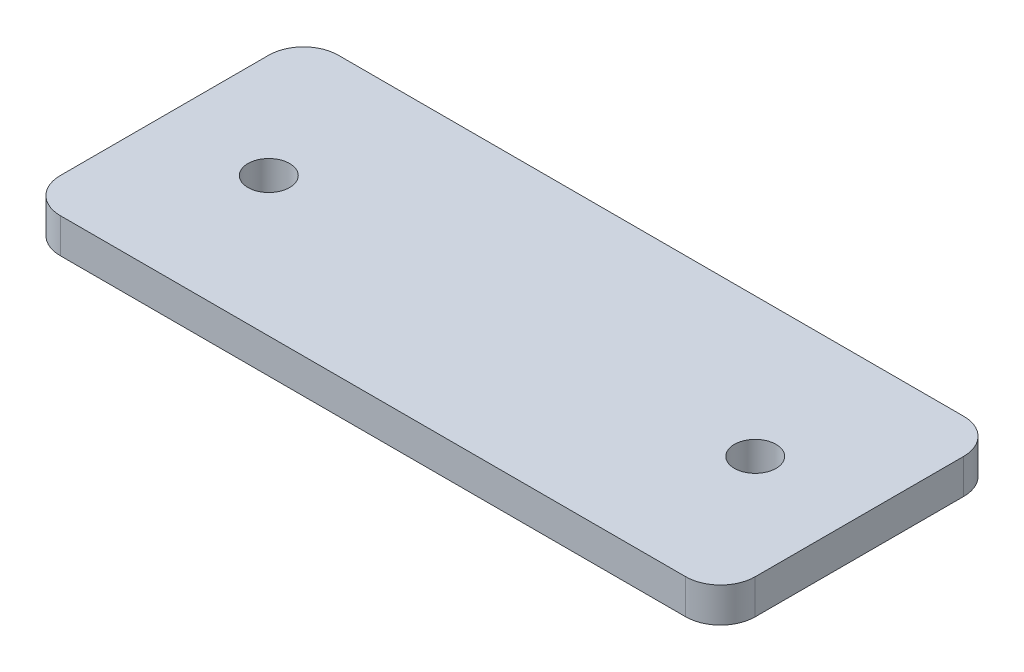
ISO-10303-21;
HEADER;
FILE_DESCRIPTION(('STEP AP214'),'2;1');
FILE_NAME('part.step','',(''),(''),'','','');
FILE_SCHEMA(('AUTOMOTIVE_DESIGN { 1 0 10303 214 1 1 1 1 }'));
ENDSEC;
DATA;
#1=APPLICATION_CONTEXT('core data for automotive mechanical design processes');
#2=APPLICATION_PROTOCOL_DEFINITION('international standard','automotive_design',2000,#1);
#3=PRODUCT_CONTEXT('',#1,'mechanical');
#4=PRODUCT('Part','Part','',(#3));
#5=PRODUCT_RELATED_PRODUCT_CATEGORY('part','',(#4));
#6=PRODUCT_DEFINITION_FORMATION('','',#4);
#7=PRODUCT_DEFINITION_CONTEXT('part definition',#1,'design');
#8=PRODUCT_DEFINITION('design','',#6,#7);
#9=PRODUCT_DEFINITION_SHAPE('','',#8);
#10=(LENGTH_UNIT() NAMED_UNIT(*) SI_UNIT(.MILLI.,.METRE.));
#11=(NAMED_UNIT(*) PLANE_ANGLE_UNIT() SI_UNIT($,.RADIAN.));
#12=(NAMED_UNIT(*) SI_UNIT($,.STERADIAN.) SOLID_ANGLE_UNIT());
#13=UNCERTAINTY_MEASURE_WITH_UNIT(LENGTH_MEASURE(1.E-05),#10,'distance_accuracy_value','');
#14=(GEOMETRIC_REPRESENTATION_CONTEXT(3) GLOBAL_UNCERTAINTY_ASSIGNED_CONTEXT((#13)) GLOBAL_UNIT_ASSIGNED_CONTEXT((#10,
#11,#12)) REPRESENTATION_CONTEXT('',''));
#15=CARTESIAN_POINT('',(0.,0.,0.));
#16=DIRECTION('',(0.,0.,1.));
#17=DIRECTION('',(1.,0.,0.));
#18=AXIS2_PLACEMENT_3D('',#15,#16,#17);
#19=CARTESIAN_POINT('',(-50.,5.,20.));
#20=DIRECTION('',(1.,0.,0.));
#21=DIRECTION('',(0.,0.,-1.));
#22=AXIS2_PLACEMENT_3D('',#19,#20,#21);
#23=PLANE('',#22);
#24=DIRECTION('',(0.,0.,1.));
#25=VECTOR('',#24,1.);
#26=CARTESIAN_POINT('',(-50.,5.,20.));
#27=LINE('',#26,#25);
#28=CARTESIAN_POINT('',(-50.,5.,-15.));
#29=VERTEX_POINT('',#28);
#30=CARTESIAN_POINT('',(-50.,5.,15.));
#31=VERTEX_POINT('',#30);
#32=EDGE_CURVE('E116',#29,#31,#27,.T.);
#33=ORIENTED_EDGE('',*,*,#32,.F.);
#34=DIRECTION('',(0.,-1.,0.));
#35=VECTOR('',#34,1.);
#36=CARTESIAN_POINT('',(-50.,5.,-15.));
#37=LINE('',#36,#35);
#38=CARTESIAN_POINT('',(-50.,0.,-15.));
#39=VERTEX_POINT('',#38);
#40=EDGE_CURVE('E101',#29,#39,#37,.T.);
#41=ORIENTED_EDGE('',*,*,#40,.T.);
#42=DIRECTION('',(0.,0.,1.));
#43=VECTOR('',#42,1.);
#44=CARTESIAN_POINT('',(-50.,0.,20.));
#45=LINE('',#44,#43);
#46=CARTESIAN_POINT('',(-50.,0.,15.));
#47=VERTEX_POINT('',#46);
#48=EDGE_CURVE('E113',#39,#47,#45,.T.);
#49=ORIENTED_EDGE('',*,*,#48,.T.);
#50=DIRECTION('',(0.,-1.,0.));
#51=VECTOR('',#50,1.);
#52=CARTESIAN_POINT('',(-50.,5.,15.));
#53=LINE('',#52,#51);
#54=EDGE_CURVE('E118',#47,#31,#53,.F.);
#55=ORIENTED_EDGE('',*,*,#54,.T.);
#56=EDGE_LOOP('',(#33,#41,#49,#55));
#57=FACE_BOUND('',#56,.T.);
#58=ADVANCED_FACE('F32',(#57),#23,.F.);
#59=CARTESIAN_POINT('',(50.,5.,20.));
#60=DIRECTION('',(0.,0.,-1.));
#61=DIRECTION('',(-1.,0.,0.));
#62=AXIS2_PLACEMENT_3D('',#59,#60,#61);
#63=PLANE('',#62);
#64=DIRECTION('',(1.,0.,0.));
#65=VECTOR('',#64,1.);
#66=CARTESIAN_POINT('',(50.,5.,20.));
#67=LINE('',#66,#65);
#68=CARTESIAN_POINT('',(-45.,5.,20.));
#69=VERTEX_POINT('',#68);
#70=CARTESIAN_POINT('',(45.,5.,20.));
#71=VERTEX_POINT('',#70);
#72=EDGE_CURVE('E171',#69,#71,#67,.T.);
#73=ORIENTED_EDGE('',*,*,#72,.F.);
#74=DIRECTION('',(0.,-1.,0.));
#75=VECTOR('',#74,1.);
#76=CARTESIAN_POINT('',(-45.,5.,20.));
#77=LINE('',#76,#75);
#78=CARTESIAN_POINT('',(-45.,0.,20.));
#79=VERTEX_POINT('',#78);
#80=EDGE_CURVE('E155',#69,#79,#77,.T.);
#81=ORIENTED_EDGE('',*,*,#80,.T.);
#82=DIRECTION('',(1.,0.,0.));
#83=VECTOR('',#82,1.);
#84=CARTESIAN_POINT('',(50.,0.,20.));
#85=LINE('',#84,#83);
#86=CARTESIAN_POINT('',(45.,0.,20.));
#87=VERTEX_POINT('',#86);
#88=EDGE_CURVE('E122',#79,#87,#85,.T.);
#89=ORIENTED_EDGE('',*,*,#88,.T.);
#90=DIRECTION('',(0.,-1.,0.));
#91=VECTOR('',#90,1.);
#92=CARTESIAN_POINT('',(45.,5.,20.));
#93=LINE('',#92,#91);
#94=EDGE_CURVE('E153',#87,#71,#93,.F.);
#95=ORIENTED_EDGE('',*,*,#94,.T.);
#96=EDGE_LOOP('',(#73,#81,#89,#95));
#97=FACE_BOUND('',#96,.T.);
#98=ADVANCED_FACE('F207',(#97),#63,.F.);
#99=CARTESIAN_POINT('',(50.,5.,20.));
#100=DIRECTION('',(-1.,0.,0.));
#101=DIRECTION('',(0.,0.,1.));
#102=AXIS2_PLACEMENT_3D('',#99,#100,#101);
#103=PLANE('',#102);
#104=DIRECTION('',(0.,0.,-1.));
#105=VECTOR('',#104,1.);
#106=CARTESIAN_POINT('',(50.,0.,20.));
#107=LINE('',#106,#105);
#108=CARTESIAN_POINT('',(50.,0.,15.));
#109=VERTEX_POINT('',#108);
#110=CARTESIAN_POINT('',(50.,0.,-15.));
#111=VERTEX_POINT('',#110);
#112=EDGE_CURVE('E126',#109,#111,#107,.T.);
#113=ORIENTED_EDGE('',*,*,#112,.T.);
#114=DIRECTION('',(0.,-1.,0.));
#115=VECTOR('',#114,1.);
#116=CARTESIAN_POINT('',(50.,5.,-15.));
#117=LINE('',#116,#115);
#118=CARTESIAN_POINT('',(50.,5.,-15.));
#119=VERTEX_POINT('',#118);
#120=EDGE_CURVE('E11',#111,#119,#117,.F.);
#121=ORIENTED_EDGE('',*,*,#120,.T.);
#122=DIRECTION('',(0.,0.,-1.));
#123=VECTOR('',#122,1.);
#124=CARTESIAN_POINT('',(50.,5.,20.));
#125=LINE('',#124,#123);
#126=CARTESIAN_POINT('',(50.,5.,15.));
#127=VERTEX_POINT('',#126);
#128=EDGE_CURVE('E161',#127,#119,#125,.T.);
#129=ORIENTED_EDGE('',*,*,#128,.F.);
#130=DIRECTION('',(0.,-1.,0.));
#131=VECTOR('',#130,1.);
#132=CARTESIAN_POINT('',(50.,5.,15.));
#133=LINE('',#132,#131);
#134=EDGE_CURVE('E40',#127,#109,#133,.T.);
#135=ORIENTED_EDGE('',*,*,#134,.T.);
#136=EDGE_LOOP('',(#113,#121,#129,#135));
#137=FACE_BOUND('',#136,.T.);
#138=ADVANCED_FACE('F160',(#137),#103,.F.);
#139=CARTESIAN_POINT('',(50.,5.,-20.));
#140=DIRECTION('',(0.,0.,1.));
#141=DIRECTION('',(1.,0.,0.));
#142=AXIS2_PLACEMENT_3D('',#139,#140,#141);
#143=PLANE('',#142);
#144=DIRECTION('',(-1.,0.,0.));
#145=VECTOR('',#144,1.);
#146=CARTESIAN_POINT('',(50.,0.,-20.));
#147=LINE('',#146,#145);
#148=CARTESIAN_POINT('',(45.,0.,-20.));
#149=VERTEX_POINT('',#148);
#150=CARTESIAN_POINT('',(-45.,0.,-20.));
#151=VERTEX_POINT('',#150);
#152=EDGE_CURVE('E136',#149,#151,#147,.T.);
#153=ORIENTED_EDGE('',*,*,#152,.T.);
#154=DIRECTION('',(0.,-1.,0.));
#155=VECTOR('',#154,1.);
#156=CARTESIAN_POINT('',(-45.,5.,-20.));
#157=LINE('',#156,#155);
#158=CARTESIAN_POINT('',(-45.,5.,-20.));
#159=VERTEX_POINT('',#158);
#160=EDGE_CURVE('E102',#151,#159,#157,.F.);
#161=ORIENTED_EDGE('',*,*,#160,.T.);
#162=DIRECTION('',(-1.,0.,0.));
#163=VECTOR('',#162,1.);
#164=CARTESIAN_POINT('',(50.,5.,-20.));
#165=LINE('',#164,#163);
#166=CARTESIAN_POINT('',(45.,5.,-20.));
#167=VERTEX_POINT('',#166);
#168=EDGE_CURVE('E132',#167,#159,#165,.T.);
#169=ORIENTED_EDGE('',*,*,#168,.F.);
#170=DIRECTION('',(0.,-1.,0.));
#171=VECTOR('',#170,1.);
#172=CARTESIAN_POINT('',(45.,5.,-20.));
#173=LINE('',#172,#171);
#174=EDGE_CURVE('E107',#167,#149,#173,.T.);
#175=ORIENTED_EDGE('',*,*,#174,.T.);
#176=EDGE_LOOP('',(#153,#161,#169,#175));
#177=FACE_BOUND('',#176,.T.);
#178=ADVANCED_FACE('F169',(#177),#143,.F.);
#179=CARTESIAN_POINT('',(0.,5.,0.));
#180=DIRECTION('',(0.,1.,0.));
#181=DIRECTION('',(0.,0.,1.));
#182=AXIS2_PLACEMENT_3D('',#179,#180,#181);
#183=PLANE('',#182);
#184=CARTESIAN_POINT('',(35.,5.,0.));
#185=DIRECTION('',(0.,1.,0.));
#186=DIRECTION('',(0.,0.,1.));
#187=AXIS2_PLACEMENT_3D('',#184,#185,#186);
#188=CIRCLE('',#187,3.);
#189=CARTESIAN_POINT('',(35.,5.,3.));
#190=VERTEX_POINT('',#189);
#191=EDGE_CURVE('E178',#190,#190,#188,.T.);
#192=ORIENTED_EDGE('',*,*,#191,.F.);
#193=EDGE_LOOP('',(#192));
#194=FACE_BOUND('',#193,.T.);
#195=CARTESIAN_POINT('',(-35.,5.,0.));
#196=DIRECTION('',(0.,1.,0.));
#197=DIRECTION('',(0.,0.,1.));
#198=AXIS2_PLACEMENT_3D('',#195,#196,#197);
#199=CIRCLE('',#198,3.);
#200=CARTESIAN_POINT('',(-35.,5.,3.));
#201=VERTEX_POINT('',#200);
#202=EDGE_CURVE('E129',#201,#201,#199,.T.);
#203=ORIENTED_EDGE('',*,*,#202,.F.);
#204=EDGE_LOOP('',(#203));
#205=FACE_BOUND('',#204,.T.);
#206=ORIENTED_EDGE('',*,*,#168,.T.);
#207=CARTESIAN_POINT('',(-45.,5.,-15.));
#208=DIRECTION('',(0.,1.,0.));
#209=DIRECTION('',(0.,0.,1.));
#210=AXIS2_PLACEMENT_3D('',#207,#208,#209);
#211=CIRCLE('',#210,5.);
#212=EDGE_CURVE('E151',#159,#29,#211,.T.);
#213=ORIENTED_EDGE('',*,*,#212,.T.);
#214=ORIENTED_EDGE('',*,*,#32,.T.);
#215=CARTESIAN_POINT('',(-45.,5.,15.));
#216=DIRECTION('',(0.,1.,0.));
#217=DIRECTION('',(0.,0.,1.));
#218=AXIS2_PLACEMENT_3D('',#215,#216,#217);
#219=CIRCLE('',#218,5.);
#220=EDGE_CURVE('E149',#31,#69,#219,.T.);
#221=ORIENTED_EDGE('',*,*,#220,.T.);
#222=ORIENTED_EDGE('',*,*,#72,.T.);
#223=CARTESIAN_POINT('',(45.,5.,15.));
#224=DIRECTION('',(0.,1.,0.));
#225=DIRECTION('',(0.,0.,1.));
#226=AXIS2_PLACEMENT_3D('',#223,#224,#225);
#227=CIRCLE('',#226,5.);
#228=EDGE_CURVE('E52',#71,#127,#227,.T.);
#229=ORIENTED_EDGE('',*,*,#228,.T.);
#230=ORIENTED_EDGE('',*,*,#128,.T.);
#231=CARTESIAN_POINT('',(45.,5.,-15.));
#232=DIRECTION('',(0.,1.,0.));
#233=DIRECTION('',(0.,0.,1.));
#234=AXIS2_PLACEMENT_3D('',#231,#232,#233);
#235=CIRCLE('',#234,5.);
#236=EDGE_CURVE('E147',#119,#167,#235,.T.);
#237=ORIENTED_EDGE('',*,*,#236,.T.);
#238=EDGE_LOOP('',(#206,#213,#214,#221,#222,#229,#230,#237));
#239=FACE_BOUND('',#238,.T.);
#240=ADVANCED_FACE('F193',(#194,#205,#239),#183,.T.);
#241=CARTESIAN_POINT('',(0.,0.,0.));
#242=DIRECTION('',(0.,1.,0.));
#243=DIRECTION('',(0.,0.,1.));
#244=AXIS2_PLACEMENT_3D('',#241,#242,#243);
#245=PLANE('',#244);
#246=CARTESIAN_POINT('',(35.,0.,0.));
#247=DIRECTION('',(0.,1.,0.));
#248=DIRECTION('',(0.,0.,1.));
#249=AXIS2_PLACEMENT_3D('',#246,#247,#248);
#250=CIRCLE('',#249,3.);
#251=CARTESIAN_POINT('',(35.,0.,3.));
#252=VERTEX_POINT('',#251);
#253=EDGE_CURVE('E176',#252,#252,#250,.T.);
#254=ORIENTED_EDGE('',*,*,#253,.T.);
#255=EDGE_LOOP('',(#254));
#256=FACE_BOUND('',#255,.T.);
#257=CARTESIAN_POINT('',(-35.,0.,0.));
#258=DIRECTION('',(0.,1.,0.));
#259=DIRECTION('',(0.,0.,1.));
#260=AXIS2_PLACEMENT_3D('',#257,#258,#259);
#261=CIRCLE('',#260,3.);
#262=CARTESIAN_POINT('',(-35.,0.,3.));
#263=VERTEX_POINT('',#262);
#264=EDGE_CURVE('E123',#263,#263,#261,.T.);
#265=ORIENTED_EDGE('',*,*,#264,.T.);
#266=EDGE_LOOP('',(#265));
#267=FACE_BOUND('',#266,.T.);
#268=ORIENTED_EDGE('',*,*,#48,.F.);
#269=CARTESIAN_POINT('',(-45.,0.,-15.));
#270=DIRECTION('',(0.,1.,0.));
#271=DIRECTION('',(0.,0.,1.));
#272=AXIS2_PLACEMENT_3D('',#269,#270,#271);
#273=CIRCLE('',#272,5.);
#274=EDGE_CURVE('E97',#39,#151,#273,.F.);
#275=ORIENTED_EDGE('',*,*,#274,.T.);
#276=ORIENTED_EDGE('',*,*,#152,.F.);
#277=CARTESIAN_POINT('',(45.,0.,-15.));
#278=DIRECTION('',(0.,1.,0.));
#279=DIRECTION('',(0.,0.,1.));
#280=AXIS2_PLACEMENT_3D('',#277,#278,#279);
#281=CIRCLE('',#280,5.);
#282=EDGE_CURVE('E140',#149,#111,#281,.F.);
#283=ORIENTED_EDGE('',*,*,#282,.T.);
#284=ORIENTED_EDGE('',*,*,#112,.F.);
#285=CARTESIAN_POINT('',(45.,0.,15.));
#286=DIRECTION('',(0.,1.,0.));
#287=DIRECTION('',(0.,0.,1.));
#288=AXIS2_PLACEMENT_3D('',#285,#286,#287);
#289=CIRCLE('',#288,5.);
#290=EDGE_CURVE('E117',#109,#87,#289,.F.);
#291=ORIENTED_EDGE('',*,*,#290,.T.);
#292=ORIENTED_EDGE('',*,*,#88,.F.);
#293=CARTESIAN_POINT('',(-45.,0.,15.));
#294=DIRECTION('',(0.,1.,0.));
#295=DIRECTION('',(0.,0.,1.));
#296=AXIS2_PLACEMENT_3D('',#293,#294,#295);
#297=CIRCLE('',#296,5.);
#298=EDGE_CURVE('E108',#79,#47,#297,.F.);
#299=ORIENTED_EDGE('',*,*,#298,.T.);
#300=EDGE_LOOP('',(#268,#275,#276,#283,#284,#291,#292,#299));
#301=FACE_BOUND('',#300,.T.);
#302=ADVANCED_FACE('F120',(#256,#267,#301),#245,.F.);
#303=CARTESIAN_POINT('',(-45.,5.,-15.));
#304=DIRECTION('',(0.,-1.,0.));
#305=DIRECTION('',(0.,0.,-1.));
#306=AXIS2_PLACEMENT_3D('',#303,#304,#305);
#307=CYLINDRICAL_SURFACE('',#306,5.);
#308=ORIENTED_EDGE('',*,*,#212,.F.);
#309=ORIENTED_EDGE('',*,*,#160,.F.);
#310=ORIENTED_EDGE('',*,*,#274,.F.);
#311=ORIENTED_EDGE('',*,*,#40,.F.);
#312=EDGE_LOOP('',(#308,#309,#310,#311));
#313=FACE_BOUND('',#312,.T.);
#314=ADVANCED_FACE('F100',(#313),#307,.T.);
#315=CARTESIAN_POINT('',(-45.,5.,15.));
#316=DIRECTION('',(0.,-1.,0.));
#317=DIRECTION('',(0.,0.,-1.));
#318=AXIS2_PLACEMENT_3D('',#315,#316,#317);
#319=CYLINDRICAL_SURFACE('',#318,5.);
#320=ORIENTED_EDGE('',*,*,#220,.F.);
#321=ORIENTED_EDGE('',*,*,#54,.F.);
#322=ORIENTED_EDGE('',*,*,#298,.F.);
#323=ORIENTED_EDGE('',*,*,#80,.F.);
#324=EDGE_LOOP('',(#320,#321,#322,#323));
#325=FACE_BOUND('',#324,.T.);
#326=ADVANCED_FACE('F218',(#325),#319,.T.);
#327=CARTESIAN_POINT('',(45.,5.,-15.));
#328=DIRECTION('',(0.,-1.,0.));
#329=DIRECTION('',(0.,0.,-1.));
#330=AXIS2_PLACEMENT_3D('',#327,#328,#329);
#331=CYLINDRICAL_SURFACE('',#330,5.);
#332=ORIENTED_EDGE('',*,*,#236,.F.);
#333=ORIENTED_EDGE('',*,*,#120,.F.);
#334=ORIENTED_EDGE('',*,*,#282,.F.);
#335=ORIENTED_EDGE('',*,*,#174,.F.);
#336=EDGE_LOOP('',(#332,#333,#334,#335));
#337=FACE_BOUND('',#336,.T.);
#338=ADVANCED_FACE('F166',(#337),#331,.T.);
#339=CARTESIAN_POINT('',(45.,5.,15.));
#340=DIRECTION('',(0.,-1.,0.));
#341=DIRECTION('',(0.,0.,-1.));
#342=AXIS2_PLACEMENT_3D('',#339,#340,#341);
#343=CYLINDRICAL_SURFACE('',#342,5.);
#344=ORIENTED_EDGE('',*,*,#228,.F.);
#345=ORIENTED_EDGE('',*,*,#94,.F.);
#346=ORIENTED_EDGE('',*,*,#290,.F.);
#347=ORIENTED_EDGE('',*,*,#134,.F.);
#348=EDGE_LOOP('',(#344,#345,#346,#347));
#349=FACE_BOUND('',#348,.T.);
#350=ADVANCED_FACE('F34',(#349),#343,.T.);
#351=CARTESIAN_POINT('',(-35.,0.,0.));
#352=DIRECTION('',(0.,1.,0.));
#353=DIRECTION('',(0.,0.,1.));
#354=AXIS2_PLACEMENT_3D('',#351,#352,#353);
#355=CYLINDRICAL_SURFACE('',#354,3.);
#356=ORIENTED_EDGE('',*,*,#264,.F.);
#357=EDGE_LOOP('',(#356));
#358=FACE_BOUND('',#357,.T.);
#359=ORIENTED_EDGE('',*,*,#202,.T.);
#360=EDGE_LOOP('',(#359));
#361=FACE_BOUND('',#360,.T.);
#362=ADVANCED_FACE('F189',(#358,#361),#355,.F.);
#363=CARTESIAN_POINT('',(35.,0.,0.));
#364=DIRECTION('',(0.,1.,0.));
#365=DIRECTION('',(0.,0.,1.));
#366=AXIS2_PLACEMENT_3D('',#363,#364,#365);
#367=CYLINDRICAL_SURFACE('',#366,3.);
#368=ORIENTED_EDGE('',*,*,#253,.F.);
#369=EDGE_LOOP('',(#368));
#370=FACE_BOUND('',#369,.T.);
#371=ORIENTED_EDGE('',*,*,#191,.T.);
#372=EDGE_LOOP('',(#371));
#373=FACE_BOUND('',#372,.T.);
#374=ADVANCED_FACE('F186',(#370,#373),#367,.F.);
#375=CLOSED_SHELL('',(#58,#98,#138,#178,#240,#302,#314,#326,#338,#350,#362,#374));
#376=MANIFOLD_SOLID_BREP('B2',#375);
#377=ADVANCED_BREP_SHAPE_REPRESENTATION('',(#18,#376),#14);
#378=SHAPE_DEFINITION_REPRESENTATION(#9,#377);
ENDSEC;
END-ISO-10303-21;
